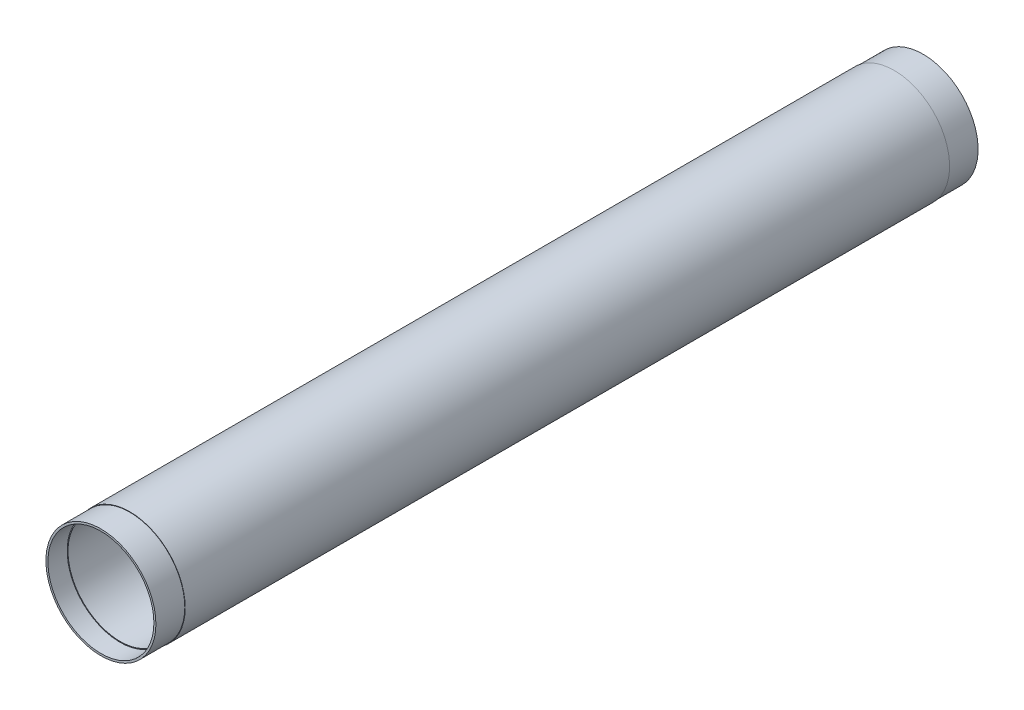
ISO-10303-21;
HEADER;
FILE_DESCRIPTION(('STEP AP214'),'2;1');
FILE_NAME('part.step','',(''),(''),'','','');
FILE_SCHEMA(('AUTOMOTIVE_DESIGN { 1 0 10303 214 1 1 1 1 }'));
ENDSEC;
DATA;
#1=APPLICATION_CONTEXT('core data for automotive mechanical design processes');
#2=APPLICATION_PROTOCOL_DEFINITION('international standard','automotive_design',2000,#1);
#3=PRODUCT_CONTEXT('',#1,'mechanical');
#4=PRODUCT('Part','Part','',(#3));
#5=PRODUCT_RELATED_PRODUCT_CATEGORY('part','',(#4));
#6=PRODUCT_DEFINITION_FORMATION('','',#4);
#7=PRODUCT_DEFINITION_CONTEXT('part definition',#1,'design');
#8=PRODUCT_DEFINITION('design','',#6,#7);
#9=PRODUCT_DEFINITION_SHAPE('','',#8);
#10=(LENGTH_UNIT() NAMED_UNIT(*) SI_UNIT(.MILLI.,.METRE.));
#11=(NAMED_UNIT(*) PLANE_ANGLE_UNIT() SI_UNIT($,.RADIAN.));
#12=(NAMED_UNIT(*) SI_UNIT($,.STERADIAN.) SOLID_ANGLE_UNIT());
#13=UNCERTAINTY_MEASURE_WITH_UNIT(LENGTH_MEASURE(1.E-05),#10,'distance_accuracy_value','');
#14=(GEOMETRIC_REPRESENTATION_CONTEXT(3) GLOBAL_UNCERTAINTY_ASSIGNED_CONTEXT((#13)) GLOBAL_UNIT_ASSIGNED_CONTEXT((#10,
#11,#12)) REPRESENTATION_CONTEXT('',''));
#15=CARTESIAN_POINT('',(0.,0.,0.));
#16=DIRECTION('',(0.,0.,1.));
#17=DIRECTION('',(1.,0.,0.));
#18=AXIS2_PLACEMENT_3D('',#15,#16,#17);
#19=CARTESIAN_POINT('',(0.,0.,512.));
#20=DIRECTION('',(0.,0.,-1.));
#21=DIRECTION('',(-1.,0.,0.));
#22=AXIS2_PLACEMENT_3D('',#19,#20,#21);
#23=CYLINDRICAL_SURFACE('',#22,34.5);
#24=CARTESIAN_POINT('',(0.,0.,494.));
#25=DIRECTION('',(0.,0.,1.));
#26=DIRECTION('',(1.,0.,0.));
#27=AXIS2_PLACEMENT_3D('',#24,#25,#26);
#28=CIRCLE('',#27,34.5);
#29=CARTESIAN_POINT('',(34.5,0.,494.));
#30=VERTEX_POINT('',#29);
#31=EDGE_CURVE('E51',#30,#30,#28,.T.);
#32=ORIENTED_EDGE('',*,*,#31,.F.);
#33=EDGE_LOOP('',(#32));
#34=FACE_BOUND('',#33,.T.);
#35=CARTESIAN_POINT('',(0.,0.,18.));
#36=DIRECTION('',(0.,0.,-1.));
#37=DIRECTION('',(-1.,0.,0.));
#38=AXIS2_PLACEMENT_3D('',#35,#36,#37);
#39=CIRCLE('',#38,34.5);
#40=CARTESIAN_POINT('',(-34.5,0.,18.));
#41=VERTEX_POINT('',#40);
#42=EDGE_CURVE('E58',#41,#41,#39,.T.);
#43=ORIENTED_EDGE('',*,*,#42,.F.);
#44=EDGE_LOOP('',(#43));
#45=FACE_BOUND('',#44,.T.);
#46=ADVANCED_FACE('F32',(#34,#45),#23,.T.);
#47=CARTESIAN_POINT('',(0.,0.,0.));
#48=DIRECTION('',(0.,0.,1.));
#49=DIRECTION('',(1.,0.,0.));
#50=AXIS2_PLACEMENT_3D('',#47,#48,#49);
#51=PLANE('',#50);
#52=CARTESIAN_POINT('',(0.,0.,0.));
#53=DIRECTION('',(0.,0.,1.));
#54=DIRECTION('',(1.,0.,0.));
#55=AXIS2_PLACEMENT_3D('',#52,#53,#54);
#56=CIRCLE('',#55,32.5);
#57=CARTESIAN_POINT('',(32.5,0.,0.));
#58=VERTEX_POINT('',#57);
#59=EDGE_CURVE('E10',#58,#58,#56,.T.);
#60=ORIENTED_EDGE('',*,*,#59,.T.);
#61=EDGE_LOOP('',(#60));
#62=FACE_BOUND('',#61,.T.);
#63=CARTESIAN_POINT('',(0.,0.,0.));
#64=DIRECTION('',(0.,0.,-1.));
#65=DIRECTION('',(-1.,0.,0.));
#66=AXIS2_PLACEMENT_3D('',#63,#64,#65);
#67=CIRCLE('',#66,34.25);
#68=CARTESIAN_POINT('',(-34.25,0.,0.));
#69=VERTEX_POINT('',#68);
#70=EDGE_CURVE('E64',#69,#69,#67,.T.);
#71=ORIENTED_EDGE('',*,*,#70,.T.);
#72=EDGE_LOOP('',(#71));
#73=FACE_BOUND('',#72,.T.);
#74=ADVANCED_FACE('F81',(#62,#73),#51,.F.);
#75=CARTESIAN_POINT('',(0.,0.,512.));
#76=DIRECTION('',(0.,0.,1.));
#77=DIRECTION('',(1.,0.,0.));
#78=AXIS2_PLACEMENT_3D('',#75,#76,#77);
#79=PLANE('',#78);
#80=CARTESIAN_POINT('',(0.,0.,512.));
#81=DIRECTION('',(0.,0.,1.));
#82=DIRECTION('',(1.,0.,0.));
#83=AXIS2_PLACEMENT_3D('',#80,#81,#82);
#84=CIRCLE('',#83,33.);
#85=CARTESIAN_POINT('',(33.,0.,512.));
#86=VERTEX_POINT('',#85);
#87=EDGE_CURVE('E42',#86,#86,#84,.T.);
#88=ORIENTED_EDGE('',*,*,#87,.F.);
#89=EDGE_LOOP('',(#88));
#90=FACE_BOUND('',#89,.T.);
#91=CARTESIAN_POINT('',(0.,0.,512.));
#92=DIRECTION('',(0.,0.,1.));
#93=DIRECTION('',(1.,0.,0.));
#94=AXIS2_PLACEMENT_3D('',#91,#92,#93);
#95=CIRCLE('',#94,34.25);
#96=CARTESIAN_POINT('',(34.25,0.,512.));
#97=VERTEX_POINT('',#96);
#98=EDGE_CURVE('E55',#97,#97,#95,.T.);
#99=ORIENTED_EDGE('',*,*,#98,.T.);
#100=EDGE_LOOP('',(#99));
#101=FACE_BOUND('',#100,.T.);
#102=ADVANCED_FACE('F86',(#90,#101),#79,.T.);
#103=CARTESIAN_POINT('',(0.,0.,512.));
#104=DIRECTION('',(0.,0.,-1.));
#105=DIRECTION('',(-1.,0.,0.));
#106=AXIS2_PLACEMENT_3D('',#103,#104,#105);
#107=CYLINDRICAL_SURFACE('',#106,32.5);
#108=ORIENTED_EDGE('',*,*,#59,.F.);
#109=EDGE_LOOP('',(#108));
#110=FACE_BOUND('',#109,.T.);
#111=CARTESIAN_POINT('',(0.,0.,500.));
#112=DIRECTION('',(0.,0.,1.));
#113=DIRECTION('',(1.,0.,0.));
#114=AXIS2_PLACEMENT_3D('',#111,#112,#113);
#115=CIRCLE('',#114,32.5);
#116=CARTESIAN_POINT('',(32.5,0.,500.));
#117=VERTEX_POINT('',#116);
#118=EDGE_CURVE('E47',#117,#117,#115,.T.);
#119=ORIENTED_EDGE('',*,*,#118,.T.);
#120=EDGE_LOOP('',(#119));
#121=FACE_BOUND('',#120,.T.);
#122=ADVANCED_FACE('F107',(#110,#121),#107,.F.);
#123=CARTESIAN_POINT('',(0.,0.,500.));
#124=DIRECTION('',(0.,0.,1.));
#125=DIRECTION('',(1.,0.,0.));
#126=AXIS2_PLACEMENT_3D('',#123,#124,#125);
#127=CYLINDRICAL_SURFACE('',#126,33.);
#128=CARTESIAN_POINT('',(0.,0.,500.));
#129=DIRECTION('',(0.,0.,1.));
#130=DIRECTION('',(1.,0.,0.));
#131=AXIS2_PLACEMENT_3D('',#128,#129,#130);
#132=CIRCLE('',#131,33.);
#133=CARTESIAN_POINT('',(33.,0.,500.));
#134=VERTEX_POINT('',#133);
#135=EDGE_CURVE('E38',#134,#134,#132,.T.);
#136=ORIENTED_EDGE('',*,*,#135,.F.);
#137=EDGE_LOOP('',(#136));
#138=FACE_BOUND('',#137,.T.);
#139=ORIENTED_EDGE('',*,*,#87,.T.);
#140=EDGE_LOOP('',(#139));
#141=FACE_BOUND('',#140,.T.);
#142=ADVANCED_FACE('F100',(#138,#141),#127,.F.);
#143=CARTESIAN_POINT('',(0.,0.,500.));
#144=DIRECTION('',(0.,0.,1.));
#145=DIRECTION('',(1.,0.,0.));
#146=AXIS2_PLACEMENT_3D('',#143,#144,#145);
#147=PLANE('',#146);
#148=ORIENTED_EDGE('',*,*,#118,.F.);
#149=EDGE_LOOP('',(#148));
#150=FACE_BOUND('',#149,.T.);
#151=ORIENTED_EDGE('',*,*,#135,.T.);
#152=EDGE_LOOP('',(#151));
#153=FACE_BOUND('',#152,.T.);
#154=ADVANCED_FACE('F91',(#150,#153),#147,.T.);
#155=CARTESIAN_POINT('',(0.,0.,494.));
#156=DIRECTION('',(0.,0.,1.));
#157=DIRECTION('',(1.,0.,0.));
#158=AXIS2_PLACEMENT_3D('',#155,#156,#157);
#159=PLANE('',#158);
#160=CARTESIAN_POINT('',(0.,0.,494.));
#161=DIRECTION('',(0.,0.,1.));
#162=DIRECTION('',(1.,0.,0.));
#163=AXIS2_PLACEMENT_3D('',#160,#161,#162);
#164=CIRCLE('',#163,34.25);
#165=CARTESIAN_POINT('',(34.25,0.,494.));
#166=VERTEX_POINT('',#165);
#167=EDGE_CURVE('E54',#166,#166,#164,.T.);
#168=ORIENTED_EDGE('',*,*,#167,.F.);
#169=EDGE_LOOP('',(#168));
#170=FACE_BOUND('',#169,.T.);
#171=ORIENTED_EDGE('',*,*,#31,.T.);
#172=EDGE_LOOP('',(#171));
#173=FACE_BOUND('',#172,.T.);
#174=ADVANCED_FACE('F89',(#170,#173),#159,.T.);
#175=CARTESIAN_POINT('',(0.,0.,494.));
#176=DIRECTION('',(0.,0.,1.));
#177=DIRECTION('',(1.,0.,0.));
#178=AXIS2_PLACEMENT_3D('',#175,#176,#177);
#179=CYLINDRICAL_SURFACE('',#178,34.25);
#180=ORIENTED_EDGE('',*,*,#167,.T.);
#181=EDGE_LOOP('',(#180));
#182=FACE_BOUND('',#181,.T.);
#183=ORIENTED_EDGE('',*,*,#98,.F.);
#184=EDGE_LOOP('',(#183));
#185=FACE_BOUND('',#184,.T.);
#186=ADVANCED_FACE('F76',(#182,#185),#179,.T.);
#187=CARTESIAN_POINT('',(0.,0.,18.));
#188=DIRECTION('',(0.,0.,-1.));
#189=DIRECTION('',(-1.,0.,0.));
#190=AXIS2_PLACEMENT_3D('',#187,#188,#189);
#191=PLANE('',#190);
#192=CARTESIAN_POINT('',(0.,0.,18.));
#193=DIRECTION('',(0.,0.,-1.));
#194=DIRECTION('',(-1.,0.,0.));
#195=AXIS2_PLACEMENT_3D('',#192,#193,#194);
#196=CIRCLE('',#195,34.25);
#197=CARTESIAN_POINT('',(-34.25,0.,18.));
#198=VERTEX_POINT('',#197);
#199=EDGE_CURVE('E63',#198,#198,#196,.T.);
#200=ORIENTED_EDGE('',*,*,#199,.F.);
#201=EDGE_LOOP('',(#200));
#202=FACE_BOUND('',#201,.T.);
#203=ORIENTED_EDGE('',*,*,#42,.T.);
#204=EDGE_LOOP('',(#203));
#205=FACE_BOUND('',#204,.T.);
#206=ADVANCED_FACE('F73',(#202,#205),#191,.T.);
#207=CARTESIAN_POINT('',(0.,0.,18.));
#208=DIRECTION('',(0.,0.,-1.));
#209=DIRECTION('',(-1.,0.,0.));
#210=AXIS2_PLACEMENT_3D('',#207,#208,#209);
#211=CYLINDRICAL_SURFACE('',#210,34.25);
#212=ORIENTED_EDGE('',*,*,#199,.T.);
#213=EDGE_LOOP('',(#212));
#214=FACE_BOUND('',#213,.T.);
#215=ORIENTED_EDGE('',*,*,#70,.F.);
#216=EDGE_LOOP('',(#215));
#217=FACE_BOUND('',#216,.T.);
#218=ADVANCED_FACE('F70',(#214,#217),#211,.T.);
#219=CLOSED_SHELL('',(#46,#74,#102,#122,#142,#154,#174,#186,#206,#218));
#220=MANIFOLD_SOLID_BREP('B2',#219);
#221=ADVANCED_BREP_SHAPE_REPRESENTATION('',(#18,#220),#14);
#222=SHAPE_DEFINITION_REPRESENTATION(#9,#221);
ENDSEC;
END-ISO-10303-21;
